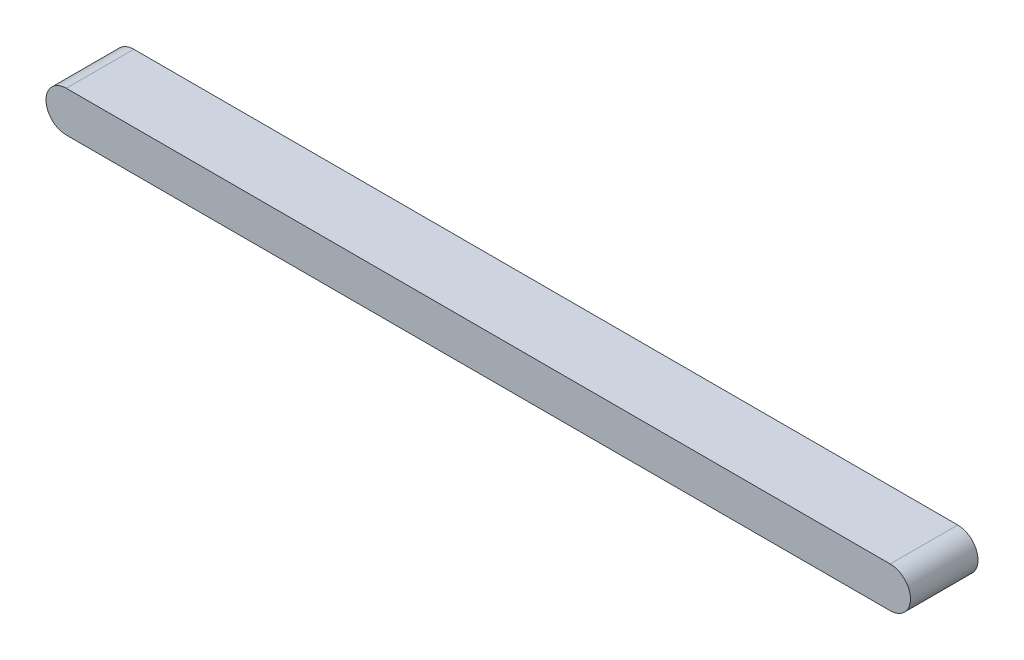
ISO-10303-21;
HEADER;
FILE_DESCRIPTION(('STEP AP214'),'2;1');
FILE_NAME('part.step','',(''),(''),'','','');
FILE_SCHEMA(('AUTOMOTIVE_DESIGN { 1 0 10303 214 1 1 1 1 }'));
ENDSEC;
DATA;
#1=APPLICATION_CONTEXT('core data for automotive mechanical design processes');
#2=APPLICATION_PROTOCOL_DEFINITION('international standard','automotive_design',2000,#1);
#3=PRODUCT_CONTEXT('',#1,'mechanical');
#4=PRODUCT('Part','Part','',(#3));
#5=PRODUCT_RELATED_PRODUCT_CATEGORY('part','',(#4));
#6=PRODUCT_DEFINITION_FORMATION('','',#4);
#7=PRODUCT_DEFINITION_CONTEXT('part definition',#1,'design');
#8=PRODUCT_DEFINITION('design','',#6,#7);
#9=PRODUCT_DEFINITION_SHAPE('','',#8);
#10=(LENGTH_UNIT() NAMED_UNIT(*) SI_UNIT(.MILLI.,.METRE.));
#11=(NAMED_UNIT(*) PLANE_ANGLE_UNIT() SI_UNIT($,.RADIAN.));
#12=(NAMED_UNIT(*) SI_UNIT($,.STERADIAN.) SOLID_ANGLE_UNIT());
#13=UNCERTAINTY_MEASURE_WITH_UNIT(LENGTH_MEASURE(1.E-05),#10,'distance_accuracy_value','');
#14=(GEOMETRIC_REPRESENTATION_CONTEXT(3) GLOBAL_UNCERTAINTY_ASSIGNED_CONTEXT((#13)) GLOBAL_UNIT_ASSIGNED_CONTEXT((#10,
#11,#12)) REPRESENTATION_CONTEXT('',''));
#15=CARTESIAN_POINT('',(0.,0.,0.));
#16=DIRECTION('',(0.,0.,1.));
#17=DIRECTION('',(1.,0.,0.));
#18=AXIS2_PLACEMENT_3D('',#15,#16,#17);
#19=CARTESIAN_POINT('',(0.,-3.,10.));
#20=DIRECTION('',(0.,0.,-1.));
#21=DIRECTION('',(-1.,0.,0.));
#22=AXIS2_PLACEMENT_3D('',#19,#20,#21);
#23=CYLINDRICAL_SURFACE('',#22,3.);
#24=CARTESIAN_POINT('',(0.,-3.,0.));
#25=DIRECTION('',(0.,0.,1.));
#26=DIRECTION('',(1.,0.,0.));
#27=AXIS2_PLACEMENT_3D('',#24,#25,#26);
#28=CIRCLE('',#27,3.);
#29=CARTESIAN_POINT('',(0.,0.,0.));
#30=VERTEX_POINT('',#29);
#31=CARTESIAN_POINT('',(0.,-6.,0.));
#32=VERTEX_POINT('',#31);
#33=EDGE_CURVE('E96',#30,#32,#28,.T.);
#34=ORIENTED_EDGE('',*,*,#33,.T.);
#35=DIRECTION('',(0.,0.,-1.));
#36=VECTOR('',#35,1.);
#37=CARTESIAN_POINT('',(0.,-6.,10.));
#38=LINE('',#37,#36);
#39=CARTESIAN_POINT('',(0.,-6.,10.));
#40=VERTEX_POINT('',#39);
#41=EDGE_CURVE('E11',#40,#32,#38,.T.);
#42=ORIENTED_EDGE('',*,*,#41,.F.);
#43=CARTESIAN_POINT('',(0.,-3.,10.));
#44=DIRECTION('',(0.,0.,1.));
#45=DIRECTION('',(1.,0.,0.));
#46=AXIS2_PLACEMENT_3D('',#43,#44,#45);
#47=CIRCLE('',#46,3.);
#48=CARTESIAN_POINT('',(0.,0.,10.));
#49=VERTEX_POINT('',#48);
#50=EDGE_CURVE('E84',#49,#40,#47,.T.);
#51=ORIENTED_EDGE('',*,*,#50,.F.);
#52=DIRECTION('',(0.,0.,-1.));
#53=VECTOR('',#52,1.);
#54=CARTESIAN_POINT('',(0.,0.,10.));
#55=LINE('',#54,#53);
#56=EDGE_CURVE('E92',#49,#30,#55,.T.);
#57=ORIENTED_EDGE('',*,*,#56,.T.);
#58=EDGE_LOOP('',(#34,#42,#51,#57));
#59=FACE_BOUND('',#58,.T.);
#60=ADVANCED_FACE('F33',(#59),#23,.T.);
#61=CARTESIAN_POINT('',(0.,-6.,10.));
#62=DIRECTION('',(0.,1.,0.));
#63=DIRECTION('',(-1.,0.,0.));
#64=AXIS2_PLACEMENT_3D('',#61,#62,#63);
#65=PLANE('',#64);
#66=DIRECTION('',(1.,0.,0.));
#67=VECTOR('',#66,1.);
#68=CARTESIAN_POINT('',(0.,-6.,0.));
#69=LINE('',#68,#67);
#70=CARTESIAN_POINT('',(122.,-6.,0.));
#71=VERTEX_POINT('',#70);
#72=EDGE_CURVE('E88',#32,#71,#69,.T.);
#73=ORIENTED_EDGE('',*,*,#72,.T.);
#74=DIRECTION('',(0.,0.,-1.));
#75=VECTOR('',#74,1.);
#76=CARTESIAN_POINT('',(122.,-6.,10.));
#77=LINE('',#76,#75);
#78=CARTESIAN_POINT('',(122.,-6.,10.));
#79=VERTEX_POINT('',#78);
#80=EDGE_CURVE('E41',#79,#71,#77,.T.);
#81=ORIENTED_EDGE('',*,*,#80,.F.);
#82=DIRECTION('',(1.,0.,0.));
#83=VECTOR('',#82,1.);
#84=CARTESIAN_POINT('',(0.,-6.,10.));
#85=LINE('',#84,#83);
#86=EDGE_CURVE('E79',#40,#79,#85,.T.);
#87=ORIENTED_EDGE('',*,*,#86,.F.);
#88=ORIENTED_EDGE('',*,*,#41,.T.);
#89=EDGE_LOOP('',(#73,#81,#87,#88));
#90=FACE_BOUND('',#89,.T.);
#91=ADVANCED_FACE('F87',(#90),#65,.F.);
#92=CARTESIAN_POINT('',(122.,-3.,10.));
#93=DIRECTION('',(0.,0.,-1.));
#94=DIRECTION('',(-1.,0.,0.));
#95=AXIS2_PLACEMENT_3D('',#92,#93,#94);
#96=CYLINDRICAL_SURFACE('',#95,3.);
#97=CARTESIAN_POINT('',(122.,-3.,0.));
#98=DIRECTION('',(0.,0.,1.));
#99=DIRECTION('',(1.,0.,0.));
#100=AXIS2_PLACEMENT_3D('',#97,#98,#99);
#101=CIRCLE('',#100,3.);
#102=CARTESIAN_POINT('',(122.,0.,0.));
#103=VERTEX_POINT('',#102);
#104=EDGE_CURVE('E66',#71,#103,#101,.T.);
#105=ORIENTED_EDGE('',*,*,#104,.T.);
#106=DIRECTION('',(0.,0.,-1.));
#107=VECTOR('',#106,1.);
#108=CARTESIAN_POINT('',(122.,0.,10.));
#109=LINE('',#108,#107);
#110=CARTESIAN_POINT('',(122.,0.,10.));
#111=VERTEX_POINT('',#110);
#112=EDGE_CURVE('E89',#111,#103,#109,.T.);
#113=ORIENTED_EDGE('',*,*,#112,.F.);
#114=CARTESIAN_POINT('',(122.,-3.,10.));
#115=DIRECTION('',(0.,0.,1.));
#116=DIRECTION('',(1.,0.,0.));
#117=AXIS2_PLACEMENT_3D('',#114,#115,#116);
#118=CIRCLE('',#117,3.);
#119=EDGE_CURVE('E82',#79,#111,#118,.T.);
#120=ORIENTED_EDGE('',*,*,#119,.F.);
#121=ORIENTED_EDGE('',*,*,#80,.T.);
#122=EDGE_LOOP('',(#105,#113,#120,#121));
#123=FACE_BOUND('',#122,.T.);
#124=ADVANCED_FACE('F90',(#123),#96,.T.);
#125=CARTESIAN_POINT('',(0.,0.,10.));
#126=DIRECTION('',(0.,-1.,0.));
#127=DIRECTION('',(0.,0.,-1.));
#128=AXIS2_PLACEMENT_3D('',#125,#126,#127);
#129=PLANE('',#128);
#130=DIRECTION('',(-1.,0.,0.));
#131=VECTOR('',#130,1.);
#132=CARTESIAN_POINT('',(0.,0.,0.));
#133=LINE('',#132,#131);
#134=EDGE_CURVE('E72',#103,#30,#133,.T.);
#135=ORIENTED_EDGE('',*,*,#134,.T.);
#136=ORIENTED_EDGE('',*,*,#56,.F.);
#137=DIRECTION('',(-1.,0.,0.));
#138=VECTOR('',#137,1.);
#139=CARTESIAN_POINT('',(0.,0.,10.));
#140=LINE('',#139,#138);
#141=EDGE_CURVE('E49',#111,#49,#140,.T.);
#142=ORIENTED_EDGE('',*,*,#141,.F.);
#143=ORIENTED_EDGE('',*,*,#112,.T.);
#144=EDGE_LOOP('',(#135,#136,#142,#143));
#145=FACE_BOUND('',#144,.T.);
#146=ADVANCED_FACE('F103',(#145),#129,.F.);
#147=CARTESIAN_POINT('',(0.,-3.,10.));
#148=DIRECTION('',(0.,0.,1.));
#149=DIRECTION('',(1.,0.,0.));
#150=AXIS2_PLACEMENT_3D('',#147,#148,#149);
#151=PLANE('',#150);
#152=ORIENTED_EDGE('',*,*,#50,.T.);
#153=ORIENTED_EDGE('',*,*,#86,.T.);
#154=ORIENTED_EDGE('',*,*,#119,.T.);
#155=ORIENTED_EDGE('',*,*,#141,.T.);
#156=EDGE_LOOP('',(#152,#153,#154,#155));
#157=FACE_BOUND('',#156,.T.);
#158=ADVANCED_FACE('F80',(#157),#151,.T.);
#159=CARTESIAN_POINT('',(0.,-3.,0.));
#160=DIRECTION('',(0.,0.,1.));
#161=DIRECTION('',(1.,0.,0.));
#162=AXIS2_PLACEMENT_3D('',#159,#160,#161);
#163=PLANE('',#162);
#164=ORIENTED_EDGE('',*,*,#33,.F.);
#165=ORIENTED_EDGE('',*,*,#134,.F.);
#166=ORIENTED_EDGE('',*,*,#104,.F.);
#167=ORIENTED_EDGE('',*,*,#72,.F.);
#168=EDGE_LOOP('',(#164,#165,#166,#167));
#169=FACE_BOUND('',#168,.T.);
#170=ADVANCED_FACE('F106',(#169),#163,.F.);
#171=CLOSED_SHELL('',(#60,#91,#124,#146,#158,#170));
#172=MANIFOLD_SOLID_BREP('B2',#171);
#173=ADVANCED_BREP_SHAPE_REPRESENTATION('',(#18,#172),#14);
#174=SHAPE_DEFINITION_REPRESENTATION(#9,#173);
ENDSEC;
END-ISO-10303-21;
